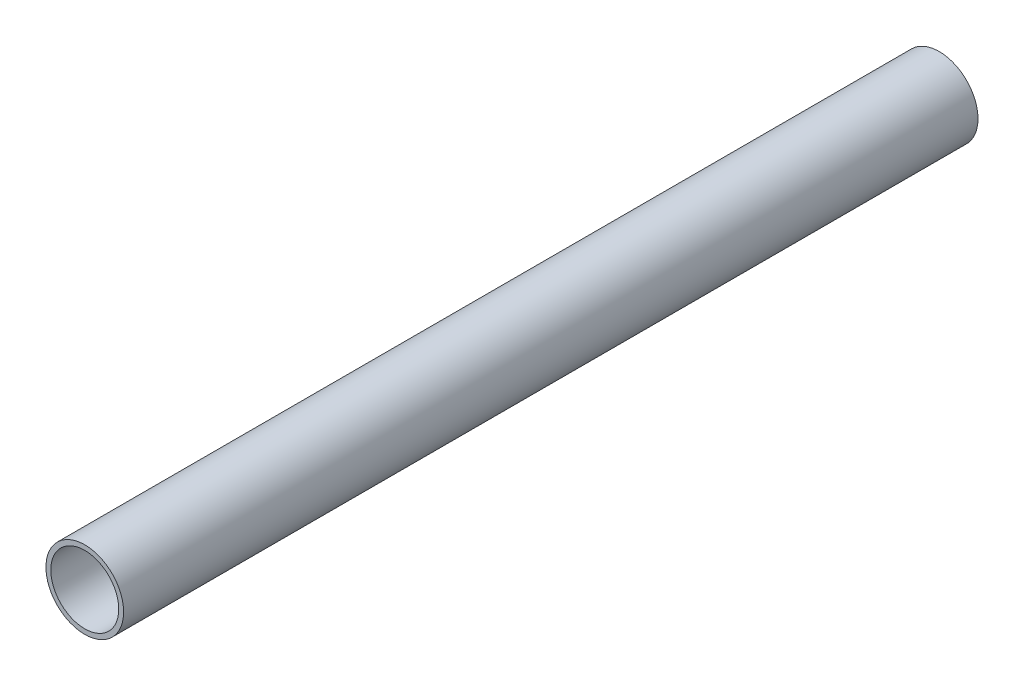
ISO-10303-21;
HEADER;
FILE_DESCRIPTION(('STEP AP214'),'2;1');
FILE_NAME('part.step','',(''),(''),'','','');
FILE_SCHEMA(('AUTOMOTIVE_DESIGN { 1 0 10303 214 1 1 1 1 }'));
ENDSEC;
DATA;
#1=APPLICATION_CONTEXT('core data for automotive mechanical design processes');
#2=APPLICATION_PROTOCOL_DEFINITION('international standard','automotive_design',2000,#1);
#3=PRODUCT_CONTEXT('',#1,'mechanical');
#4=PRODUCT('Part','Part','',(#3));
#5=PRODUCT_RELATED_PRODUCT_CATEGORY('part','',(#4));
#6=PRODUCT_DEFINITION_FORMATION('','',#4);
#7=PRODUCT_DEFINITION_CONTEXT('part definition',#1,'design');
#8=PRODUCT_DEFINITION('design','',#6,#7);
#9=PRODUCT_DEFINITION_SHAPE('','',#8);
#10=(LENGTH_UNIT() NAMED_UNIT(*) SI_UNIT(.MILLI.,.METRE.));
#11=(NAMED_UNIT(*) PLANE_ANGLE_UNIT() SI_UNIT($,.RADIAN.));
#12=(NAMED_UNIT(*) SI_UNIT($,.STERADIAN.) SOLID_ANGLE_UNIT());
#13=UNCERTAINTY_MEASURE_WITH_UNIT(LENGTH_MEASURE(1.E-05),#10,'distance_accuracy_value','');
#14=(GEOMETRIC_REPRESENTATION_CONTEXT(3) GLOBAL_UNCERTAINTY_ASSIGNED_CONTEXT((#13)) GLOBAL_UNIT_ASSIGNED_CONTEXT((#10,
#11,#12)) REPRESENTATION_CONTEXT('',''));
#15=CARTESIAN_POINT('',(0.,0.,0.));
#16=DIRECTION('',(0.,0.,1.));
#17=DIRECTION('',(1.,0.,0.));
#18=AXIS2_PLACEMENT_3D('',#15,#16,#17);
#19=CARTESIAN_POINT('',(0.,0.,279.4));
#20=DIRECTION('',(0.,0.,1.));
#21=DIRECTION('',(1.,0.,0.));
#22=AXIS2_PLACEMENT_3D('',#19,#20,#21);
#23=PLANE('',#22);
#24=CARTESIAN_POINT('',(0.,0.,279.4));
#25=DIRECTION('',(0.,0.,1.));
#26=DIRECTION('',(1.,0.,0.));
#27=AXIS2_PLACEMENT_3D('',#24,#25,#26);
#28=CIRCLE('',#27,12.7);
#29=CARTESIAN_POINT('',(12.7,0.,279.4));
#30=VERTEX_POINT('',#29);
#31=EDGE_CURVE('E10',#30,#30,#28,.T.);
#32=ORIENTED_EDGE('',*,*,#31,.T.);
#33=EDGE_LOOP('',(#32));
#34=FACE_BOUND('',#33,.T.);
#35=CARTESIAN_POINT('',(0.,0.,279.4));
#36=DIRECTION('',(0.,0.,1.));
#37=DIRECTION('',(1.,0.,0.));
#38=AXIS2_PLACEMENT_3D('',#35,#36,#37);
#39=CIRCLE('',#38,11.1125);
#40=CARTESIAN_POINT('',(11.1125,0.,279.4));
#41=VERTEX_POINT('',#40);
#42=EDGE_CURVE('E61',#41,#41,#39,.T.);
#43=ORIENTED_EDGE('',*,*,#42,.F.);
#44=EDGE_LOOP('',(#43));
#45=FACE_BOUND('',#44,.T.);
#46=ADVANCED_FACE('F47',(#34,#45),#23,.T.);
#47=CARTESIAN_POINT('',(0.,0.,0.));
#48=DIRECTION('',(0.,0.,1.));
#49=DIRECTION('',(1.,0.,0.));
#50=AXIS2_PLACEMENT_3D('',#47,#48,#49);
#51=PLANE('',#50);
#52=CARTESIAN_POINT('',(0.,0.,0.));
#53=DIRECTION('',(0.,0.,1.));
#54=DIRECTION('',(1.,0.,0.));
#55=AXIS2_PLACEMENT_3D('',#52,#53,#54);
#56=CIRCLE('',#55,12.7);
#57=CARTESIAN_POINT('',(12.7,0.,0.));
#58=VERTEX_POINT('',#57);
#59=EDGE_CURVE('E51',#58,#58,#56,.T.);
#60=ORIENTED_EDGE('',*,*,#59,.F.);
#61=EDGE_LOOP('',(#60));
#62=FACE_BOUND('',#61,.T.);
#63=CARTESIAN_POINT('',(0.,0.,0.));
#64=DIRECTION('',(0.,0.,1.));
#65=DIRECTION('',(1.,0.,0.));
#66=AXIS2_PLACEMENT_3D('',#63,#64,#65);
#67=CIRCLE('',#66,11.1125);
#68=CARTESIAN_POINT('',(11.1125,0.,0.));
#69=VERTEX_POINT('',#68);
#70=EDGE_CURVE('E63',#69,#69,#67,.T.);
#71=ORIENTED_EDGE('',*,*,#70,.T.);
#72=EDGE_LOOP('',(#71));
#73=FACE_BOUND('',#72,.T.);
#74=ADVANCED_FACE('F74',(#62,#73),#51,.F.);
#75=CARTESIAN_POINT('',(0.,0.,279.4));
#76=DIRECTION('',(0.,0.,-1.));
#77=DIRECTION('',(-1.,0.,0.));
#78=AXIS2_PLACEMENT_3D('',#75,#76,#77);
#79=CYLINDRICAL_SURFACE('',#78,12.7);
#80=ORIENTED_EDGE('',*,*,#31,.F.);
#81=EDGE_LOOP('',(#80));
#82=FACE_BOUND('',#81,.T.);
#83=ORIENTED_EDGE('',*,*,#59,.T.);
#84=EDGE_LOOP('',(#83));
#85=FACE_BOUND('',#84,.T.);
#86=ADVANCED_FACE('F49',(#82,#85),#79,.T.);
#87=CARTESIAN_POINT('',(0.,0.,279.4));
#88=DIRECTION('',(0.,0.,-1.));
#89=DIRECTION('',(-1.,0.,0.));
#90=AXIS2_PLACEMENT_3D('',#87,#88,#89);
#91=CYLINDRICAL_SURFACE('',#90,11.1125);
#92=ORIENTED_EDGE('',*,*,#42,.T.);
#93=EDGE_LOOP('',(#92));
#94=FACE_BOUND('',#93,.T.);
#95=ORIENTED_EDGE('',*,*,#70,.F.);
#96=EDGE_LOOP('',(#95));
#97=FACE_BOUND('',#96,.T.);
#98=ADVANCED_FACE('F70',(#94,#97),#91,.F.);
#99=CLOSED_SHELL('',(#46,#74,#86,#98));
#100=MANIFOLD_SOLID_BREP('B2',#99);
#101=ADVANCED_BREP_SHAPE_REPRESENTATION('',(#18,#100),#14);
#102=SHAPE_DEFINITION_REPRESENTATION(#9,#101);
ENDSEC;
END-ISO-10303-21;
